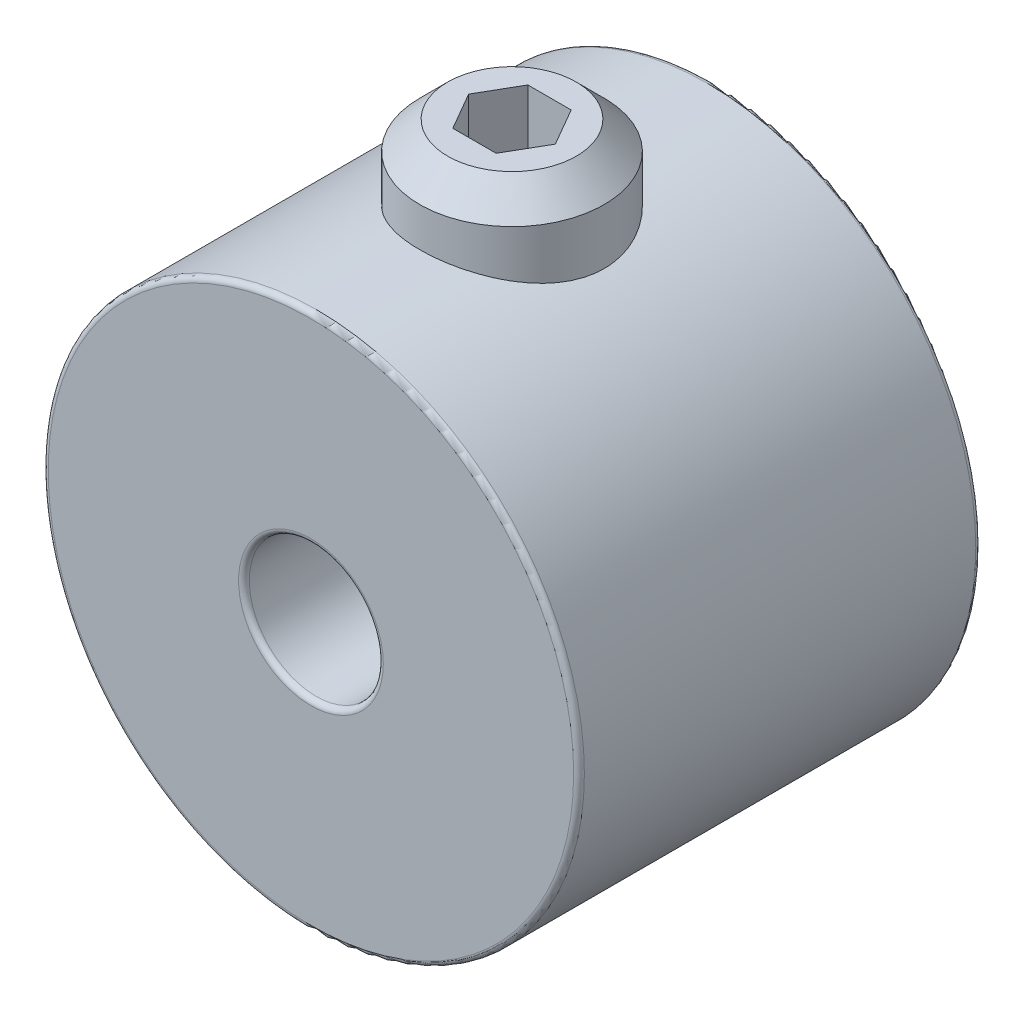
ISO-10303-21;
HEADER;
FILE_DESCRIPTION(('STEP AP214'),'2;1');
FILE_NAME('part.step','',(''),(''),'','','');
FILE_SCHEMA(('AUTOMOTIVE_DESIGN { 1 0 10303 214 1 1 1 1 }'));
ENDSEC;
DATA;
#1=APPLICATION_CONTEXT('core data for automotive mechanical design processes');
#2=APPLICATION_PROTOCOL_DEFINITION('international standard','automotive_design',2000,#1);
#3=PRODUCT_CONTEXT('',#1,'mechanical');
#4=PRODUCT('Part','Part','',(#3));
#5=PRODUCT_RELATED_PRODUCT_CATEGORY('part','',(#4));
#6=PRODUCT_DEFINITION_FORMATION('','',#4);
#7=PRODUCT_DEFINITION_CONTEXT('part definition',#1,'design');
#8=PRODUCT_DEFINITION('design','',#6,#7);
#9=PRODUCT_DEFINITION_SHAPE('','',#8);
#10=(LENGTH_UNIT() NAMED_UNIT(*) SI_UNIT(.MILLI.,.METRE.));
#11=(NAMED_UNIT(*) PLANE_ANGLE_UNIT() SI_UNIT($,.RADIAN.));
#12=(NAMED_UNIT(*) SI_UNIT($,.STERADIAN.) SOLID_ANGLE_UNIT());
#13=UNCERTAINTY_MEASURE_WITH_UNIT(LENGTH_MEASURE(1.E-05),#10,'distance_accuracy_value','');
#14=(GEOMETRIC_REPRESENTATION_CONTEXT(3) GLOBAL_UNCERTAINTY_ASSIGNED_CONTEXT((#13)) GLOBAL_UNIT_ASSIGNED_CONTEXT((#10,
#11,#12)) REPRESENTATION_CONTEXT('',''));
#15=CARTESIAN_POINT('',(0.,0.,0.));
#16=DIRECTION('',(0.,0.,1.));
#17=DIRECTION('',(1.,0.,0.));
#18=AXIS2_PLACEMENT_3D('',#15,#16,#17);
#19=CARTESIAN_POINT('',(0.,3.96875,0.));
#20=DIRECTION('',(0.,1.,0.));
#21=DIRECTION('',(-1.,0.,0.));
#22=AXIS2_PLACEMENT_3D('',#19,#20,#21);
#23=PLANE('',#22);
#24=CARTESIAN_POINT('',(0.,3.96875,0.));
#25=DIRECTION('',(0.,1.,0.));
#26=DIRECTION('',(-1.,0.,0.));
#27=AXIS2_PLACEMENT_3D('',#24,#25,#26);
#28=CIRCLE('',#27,0.761379651034047);
#29=CARTESIAN_POINT('',(-0.761379651034046,3.96875,0.));
#30=VERTEX_POINT('',#29);
#31=EDGE_CURVE('E12',#30,#30,#28,.T.);
#32=ORIENTED_EDGE('',*,*,#31,.T.);
#33=EDGE_LOOP('',(#32));
#34=FACE_BOUND('',#33,.T.);
#35=DIRECTION('',(1.,0.,0.));
#36=VECTOR('',#35,1.);
#37=CARTESIAN_POINT('',(-0.256632194654789,3.96874999999999,-0.444499999999997));
#38=LINE('',#37,#36);
#39=CARTESIAN_POINT('',(-0.256632194654789,3.96874999999999,-0.444499999999997));
#40=VERTEX_POINT('',#39);
#41=CARTESIAN_POINT('',(0.256632194654789,3.96875,-0.444499999999997));
#42=VERTEX_POINT('',#41);
#43=EDGE_CURVE('E112',#40,#42,#38,.T.);
#44=ORIENTED_EDGE('',*,*,#43,.T.);
#45=DIRECTION('',(0.5,0.,0.866025403784439));
#46=VECTOR('',#45,1.);
#47=CARTESIAN_POINT('',(0.256632194654789,3.96874999999999,-0.444499999999997));
#48=LINE('',#47,#46);
#49=CARTESIAN_POINT('',(0.513264389309578,3.96874999999999,0.));
#50=VERTEX_POINT('',#49);
#51=EDGE_CURVE('E58',#42,#50,#48,.T.);
#52=ORIENTED_EDGE('',*,*,#51,.T.);
#53=DIRECTION('',(-0.5,0.,0.866025403784439));
#54=VECTOR('',#53,1.);
#55=CARTESIAN_POINT('',(0.513264389309578,3.96874999999999,0.));
#56=LINE('',#55,#54);
#57=CARTESIAN_POINT('',(0.256632194654789,3.96874999999999,0.444500000000003));
#58=VERTEX_POINT('',#57);
#59=EDGE_CURVE('E116',#50,#58,#56,.T.);
#60=ORIENTED_EDGE('',*,*,#59,.T.);
#61=DIRECTION('',(-1.,0.,0.));
#62=VECTOR('',#61,1.);
#63=CARTESIAN_POINT('',(0.256632194654789,3.96874999999999,0.444500000000003));
#64=LINE('',#63,#62);
#65=CARTESIAN_POINT('',(-0.256632194654788,3.96874999999999,0.444500000000003));
#66=VERTEX_POINT('',#65);
#67=EDGE_CURVE('E179',#58,#66,#64,.T.);
#68=ORIENTED_EDGE('',*,*,#67,.T.);
#69=DIRECTION('',(-0.5,0.,-0.866025403784439));
#70=VECTOR('',#69,1.);
#71=CARTESIAN_POINT('',(-0.256632194654788,3.96874999999999,0.444500000000003));
#72=LINE('',#71,#70);
#73=CARTESIAN_POINT('',(-0.513264389309577,3.96874999999999,0.));
#74=VERTEX_POINT('',#73);
#75=EDGE_CURVE('E164',#66,#74,#72,.T.);
#76=ORIENTED_EDGE('',*,*,#75,.T.);
#77=DIRECTION('',(0.5,0.,-0.866025403784439));
#78=VECTOR('',#77,1.);
#79=CARTESIAN_POINT('',(-0.513264389309577,3.96874999999999,0.));
#80=LINE('',#79,#78);
#81=EDGE_CURVE('E160',#74,#40,#80,.T.);
#82=ORIENTED_EDGE('',*,*,#81,.T.);
#83=EDGE_LOOP('',(#44,#52,#60,#68,#76,#82));
#84=FACE_BOUND('',#83,.T.);
#85=ADVANCED_FACE('F44',(#34,#84),#23,.T.);
#86=CARTESIAN_POINT('',(0.,3.96875,0.));
#87=DIRECTION('',(0.,-1.,0.));
#88=DIRECTION('',(1.,0.,0.));
#89=AXIS2_PLACEMENT_3D('',#86,#87,#88);
#90=CONICAL_SURFACE('',#89,0.761379651034047,0.785398163397447);
#91=CARTESIAN_POINT('',(0.,3.63792965103404,0.));
#92=DIRECTION('',(0.,1.,0.));
#93=DIRECTION('',(-1.,0.,0.));
#94=AXIS2_PLACEMENT_3D('',#91,#92,#93);
#95=CIRCLE('',#94,1.0922);
#96=CARTESIAN_POINT('',(-1.0922,3.63792965103404,0.));
#97=VERTEX_POINT('',#96);
#98=EDGE_CURVE('E51',#97,#97,#95,.T.);
#99=ORIENTED_EDGE('',*,*,#98,.T.);
#100=EDGE_LOOP('',(#99));
#101=FACE_BOUND('',#100,.T.);
#102=ORIENTED_EDGE('',*,*,#31,.F.);
#103=EDGE_LOOP('',(#102));
#104=FACE_BOUND('',#103,.T.);
#105=ADVANCED_FACE('F134',(#101,#104),#90,.T.);
#106=CARTESIAN_POINT('',(0.,0.79375,0.));
#107=DIRECTION('',(0.,1.,0.));
#108=DIRECTION('',(-1.,0.,0.));
#109=AXIS2_PLACEMENT_3D('',#106,#107,#108);
#110=CYLINDRICAL_SURFACE('',#109,1.0922);
#111=CARTESIAN_POINT('',(0.,1.12457034896596,0.));
#112=DIRECTION('',(0.,1.,0.));
#113=DIRECTION('',(-1.,0.,0.));
#114=AXIS2_PLACEMENT_3D('',#111,#112,#113);
#115=CIRCLE('',#114,1.0922);
#116=CARTESIAN_POINT('',(-1.0922,1.12457034896596,0.));
#117=VERTEX_POINT('',#116);
#118=EDGE_CURVE('E129',#117,#117,#115,.T.);
#119=ORIENTED_EDGE('',*,*,#118,.T.);
#120=EDGE_LOOP('',(#119));
#121=FACE_BOUND('',#120,.T.);
#122=ORIENTED_EDGE('',*,*,#98,.F.);
#123=EDGE_LOOP('',(#122));
#124=FACE_BOUND('',#123,.T.);
#125=ADVANCED_FACE('F137',(#121,#124),#110,.T.);
#126=CARTESIAN_POINT('',(0.,1.12457034896596,0.));
#127=DIRECTION('',(0.,1.,0.));
#128=DIRECTION('',(-1.,0.,0.));
#129=AXIS2_PLACEMENT_3D('',#126,#127,#128);
#130=CONICAL_SURFACE('',#129,1.0922,0.785398163397448);
#131=CARTESIAN_POINT('',(0.,0.79375,0.));
#132=DIRECTION('',(0.,1.,0.));
#133=DIRECTION('',(-1.,0.,0.));
#134=AXIS2_PLACEMENT_3D('',#131,#132,#133);
#135=CIRCLE('',#134,0.761379651034046);
#136=CARTESIAN_POINT('',(-0.761379651034046,0.79375,0.));
#137=VERTEX_POINT('',#136);
#138=EDGE_CURVE('E121',#137,#137,#135,.T.);
#139=ORIENTED_EDGE('',*,*,#138,.T.);
#140=EDGE_LOOP('',(#139));
#141=FACE_BOUND('',#140,.T.);
#142=ORIENTED_EDGE('',*,*,#118,.F.);
#143=EDGE_LOOP('',(#142));
#144=FACE_BOUND('',#143,.T.);
#145=ADVANCED_FACE('F139',(#141,#144),#130,.T.);
#146=CARTESIAN_POINT('',(-0.761379651034046,0.79375,0.));
#147=DIRECTION('',(0.,-1.,0.));
#148=DIRECTION('',(1.,0.,0.));
#149=AXIS2_PLACEMENT_3D('',#146,#147,#148);
#150=PLANE('',#149);
#151=CARTESIAN_POINT('',(0.,0.79375,0.));
#152=DIRECTION('',(0.,1.,0.));
#153=DIRECTION('',(-1.,0.,0.));
#154=AXIS2_PLACEMENT_3D('',#151,#152,#153);
#155=CIRCLE('',#154,0.396984418759147);
#156=CARTESIAN_POINT('',(-0.396984418759147,0.79375,0.));
#157=VERTEX_POINT('',#156);
#158=EDGE_CURVE('E117',#157,#157,#155,.T.);
#159=ORIENTED_EDGE('',*,*,#158,.T.);
#160=EDGE_LOOP('',(#159));
#161=FACE_BOUND('',#160,.T.);
#162=ORIENTED_EDGE('',*,*,#138,.F.);
#163=EDGE_LOOP('',(#162));
#164=FACE_BOUND('',#163,.T.);
#165=ADVANCED_FACE('F146',(#161,#164),#150,.T.);
#166=CARTESIAN_POINT('',(0.,0.79375,0.));
#167=DIRECTION('',(0.,-1.,0.));
#168=DIRECTION('',(1.,0.,0.));
#169=AXIS2_PLACEMENT_3D('',#166,#167,#168);
#170=CONICAL_SURFACE('',#169,0.396984418759147,0.785398163397448);
#171=CARTESIAN_POINT('',(0.,1.19073441875915,0.));
#172=VERTEX_POINT('',#171);
#173=VERTEX_LOOP('',#172);
#174=FACE_BOUND('',#173,.T.);
#175=ORIENTED_EDGE('',*,*,#158,.F.);
#176=EDGE_LOOP('',(#175));
#177=FACE_BOUND('',#176,.T.);
#178=ADVANCED_FACE('F213',(#174,#177),#170,.F.);
#179=CARTESIAN_POINT('',(0.256632194654789,3.07974999999999,-0.444499999999997));
#180=DIRECTION('',(-0.866025403784439,0.,0.5));
#181=DIRECTION('',(0.5,0.,0.866025403784439));
#182=AXIS2_PLACEMENT_3D('',#179,#180,#181);
#183=PLANE('',#182);
#184=ORIENTED_EDGE('',*,*,#51,.F.);
#185=DIRECTION('',(0.,1.,0.));
#186=VECTOR('',#185,1.);
#187=CARTESIAN_POINT('',(0.256632194654789,3.07974999999999,-0.444499999999997));
#188=LINE('',#187,#186);
#189=CARTESIAN_POINT('',(0.256632194654789,3.07974999999999,-0.444499999999997));
#190=VERTEX_POINT('',#189);
#191=EDGE_CURVE('E111',#190,#42,#188,.T.);
#192=ORIENTED_EDGE('',*,*,#191,.F.);
#193=DIRECTION('',(0.5,0.,0.866025403784439));
#194=VECTOR('',#193,1.);
#195=CARTESIAN_POINT('',(0.256632194654789,3.07974999999999,-0.444499999999997));
#196=LINE('',#195,#194);
#197=CARTESIAN_POINT('',(0.513264389309578,3.07974999999999,0.));
#198=VERTEX_POINT('',#197);
#199=EDGE_CURVE('E102',#190,#198,#196,.T.);
#200=ORIENTED_EDGE('',*,*,#199,.T.);
#201=DIRECTION('',(0.,1.,0.));
#202=VECTOR('',#201,1.);
#203=CARTESIAN_POINT('',(0.513264389309578,3.07974999999999,0.));
#204=LINE('',#203,#202);
#205=EDGE_CURVE('E110',#198,#50,#204,.T.);
#206=ORIENTED_EDGE('',*,*,#205,.T.);
#207=EDGE_LOOP('',(#184,#192,#200,#206));
#208=FACE_BOUND('',#207,.T.);
#209=ADVANCED_FACE('F109',(#208),#183,.T.);
#210=CARTESIAN_POINT('',(0.513264389309578,3.07974999999999,0.));
#211=DIRECTION('',(-0.866025403784439,0.,-0.5));
#212=DIRECTION('',(-0.5,0.,0.866025403784439));
#213=AXIS2_PLACEMENT_3D('',#210,#211,#212);
#214=PLANE('',#213);
#215=ORIENTED_EDGE('',*,*,#59,.F.);
#216=ORIENTED_EDGE('',*,*,#205,.F.);
#217=DIRECTION('',(-0.5,0.,0.866025403784439));
#218=VECTOR('',#217,1.);
#219=CARTESIAN_POINT('',(0.513264389309578,3.07974999999999,0.));
#220=LINE('',#219,#218);
#221=CARTESIAN_POINT('',(0.256632194654789,3.07974999999999,0.444500000000003));
#222=VERTEX_POINT('',#221);
#223=EDGE_CURVE('E98',#198,#222,#220,.T.);
#224=ORIENTED_EDGE('',*,*,#223,.T.);
#225=DIRECTION('',(0.,1.,0.));
#226=VECTOR('',#225,1.);
#227=CARTESIAN_POINT('',(0.256632194654789,3.07974999999999,0.444500000000003));
#228=LINE('',#227,#226);
#229=EDGE_CURVE('E118',#222,#58,#228,.T.);
#230=ORIENTED_EDGE('',*,*,#229,.T.);
#231=EDGE_LOOP('',(#215,#216,#224,#230));
#232=FACE_BOUND('',#231,.T.);
#233=ADVANCED_FACE('F114',(#232),#214,.T.);
#234=CARTESIAN_POINT('',(0.256632194654789,3.07974999999999,0.444500000000003));
#235=DIRECTION('',(0.,0.,-1.));
#236=DIRECTION('',(-1.,0.,0.));
#237=AXIS2_PLACEMENT_3D('',#234,#235,#236);
#238=PLANE('',#237);
#239=ORIENTED_EDGE('',*,*,#67,.F.);
#240=ORIENTED_EDGE('',*,*,#229,.F.);
#241=DIRECTION('',(-1.,0.,0.));
#242=VECTOR('',#241,1.);
#243=CARTESIAN_POINT('',(0.256632194654789,3.07974999999999,0.444500000000003));
#244=LINE('',#243,#242);
#245=CARTESIAN_POINT('',(-0.256632194654788,3.07974999999999,0.444500000000003));
#246=VERTEX_POINT('',#245);
#247=EDGE_CURVE('E104',#222,#246,#244,.T.);
#248=ORIENTED_EDGE('',*,*,#247,.T.);
#249=DIRECTION('',(0.,1.,0.));
#250=VECTOR('',#249,1.);
#251=CARTESIAN_POINT('',(-0.256632194654788,3.07974999999999,0.444500000000003));
#252=LINE('',#251,#250);
#253=EDGE_CURVE('E123',#246,#66,#252,.T.);
#254=ORIENTED_EDGE('',*,*,#253,.T.);
#255=EDGE_LOOP('',(#239,#240,#248,#254));
#256=FACE_BOUND('',#255,.T.);
#257=ADVANCED_FACE('F177',(#256),#238,.T.);
#258=CARTESIAN_POINT('',(-0.256632194654788,3.07974999999999,0.444500000000003));
#259=DIRECTION('',(0.866025403784438,0.,-0.5));
#260=DIRECTION('',(-0.5,0.,-0.866025403784438));
#261=AXIS2_PLACEMENT_3D('',#258,#259,#260);
#262=PLANE('',#261);
#263=ORIENTED_EDGE('',*,*,#75,.F.);
#264=ORIENTED_EDGE('',*,*,#253,.F.);
#265=DIRECTION('',(-0.5,0.,-0.866025403784439));
#266=VECTOR('',#265,1.);
#267=CARTESIAN_POINT('',(-0.256632194654788,3.07974999999999,0.444500000000003));
#268=LINE('',#267,#266);
#269=CARTESIAN_POINT('',(-0.513264389309577,3.07974999999999,0.));
#270=VERTEX_POINT('',#269);
#271=EDGE_CURVE('E190',#246,#270,#268,.T.);
#272=ORIENTED_EDGE('',*,*,#271,.T.);
#273=DIRECTION('',(0.,1.,0.));
#274=VECTOR('',#273,1.);
#275=CARTESIAN_POINT('',(-0.513264389309577,3.07974999999999,0.));
#276=LINE('',#275,#274);
#277=EDGE_CURVE('E172',#270,#74,#276,.T.);
#278=ORIENTED_EDGE('',*,*,#277,.T.);
#279=EDGE_LOOP('',(#263,#264,#272,#278));
#280=FACE_BOUND('',#279,.T.);
#281=ADVANCED_FACE('F181',(#280),#262,.T.);
#282=CARTESIAN_POINT('',(-0.513264389309577,3.07974999999999,0.));
#283=DIRECTION('',(0.866025403784439,0.,0.5));
#284=DIRECTION('',(0.5,0.,-0.866025403784439));
#285=AXIS2_PLACEMENT_3D('',#282,#283,#284);
#286=PLANE('',#285);
#287=ORIENTED_EDGE('',*,*,#81,.F.);
#288=ORIENTED_EDGE('',*,*,#277,.F.);
#289=DIRECTION('',(0.5,0.,-0.866025403784439));
#290=VECTOR('',#289,1.);
#291=CARTESIAN_POINT('',(-0.513264389309577,3.07974999999999,0.));
#292=LINE('',#291,#290);
#293=CARTESIAN_POINT('',(-0.256632194654789,3.07974999999999,-0.444499999999997));
#294=VERTEX_POINT('',#293);
#295=EDGE_CURVE('E188',#270,#294,#292,.T.);
#296=ORIENTED_EDGE('',*,*,#295,.T.);
#297=DIRECTION('',(0.,1.,0.));
#298=VECTOR('',#297,1.);
#299=CARTESIAN_POINT('',(-0.256632194654789,3.07974999999999,-0.444499999999997));
#300=LINE('',#299,#298);
#301=EDGE_CURVE('E169',#294,#40,#300,.T.);
#302=ORIENTED_EDGE('',*,*,#301,.T.);
#303=EDGE_LOOP('',(#287,#288,#296,#302));
#304=FACE_BOUND('',#303,.T.);
#305=ADVANCED_FACE('F194',(#304),#286,.T.);
#306=CARTESIAN_POINT('',(-0.256632194654789,3.07974999999999,-0.444499999999997));
#307=DIRECTION('',(0.,0.,1.));
#308=DIRECTION('',(1.,0.,0.));
#309=AXIS2_PLACEMENT_3D('',#306,#307,#308);
#310=PLANE('',#309);
#311=ORIENTED_EDGE('',*,*,#43,.F.);
#312=ORIENTED_EDGE('',*,*,#301,.F.);
#313=DIRECTION('',(1.,0.,0.));
#314=VECTOR('',#313,1.);
#315=CARTESIAN_POINT('',(-0.256632194654789,3.07974999999999,-0.444499999999997));
#316=LINE('',#315,#314);
#317=EDGE_CURVE('E170',#294,#190,#316,.T.);
#318=ORIENTED_EDGE('',*,*,#317,.T.);
#319=ORIENTED_EDGE('',*,*,#191,.T.);
#320=EDGE_LOOP('',(#311,#312,#318,#319));
#321=FACE_BOUND('',#320,.T.);
#322=ADVANCED_FACE('F195',(#321),#310,.T.);
#323=CARTESIAN_POINT('',(0.769896583964366,3.07974999999999,0.444500000000003));
#324=DIRECTION('',(0.,-1.,0.));
#325=DIRECTION('',(0.,0.,-1.));
#326=AXIS2_PLACEMENT_3D('',#323,#324,#325);
#327=PLANE('',#326);
#328=ORIENTED_EDGE('',*,*,#199,.F.);
#329=ORIENTED_EDGE('',*,*,#317,.F.);
#330=ORIENTED_EDGE('',*,*,#295,.F.);
#331=ORIENTED_EDGE('',*,*,#271,.F.);
#332=ORIENTED_EDGE('',*,*,#247,.F.);
#333=ORIENTED_EDGE('',*,*,#223,.F.);
#334=EDGE_LOOP('',(#328,#329,#330,#331,#332,#333));
#335=FACE_BOUND('',#334,.T.);
#336=ADVANCED_FACE('F100',(#335),#327,.F.);
#337=CLOSED_SHELL('',(#85,#105,#125,#145,#165,#178,#209,#233,#257,#281,#305,#322,#336));
#338=MANIFOLD_SOLID_BREP('B2',#337);
#339=CARTESIAN_POINT('',(0.,0.,2.38125));
#340=DIRECTION('',(0.,0.,1.));
#341=DIRECTION('',(1.,0.,0.));
#342=AXIS2_PLACEMENT_3D('',#339,#340,#341);
#343=PLANE('',#342);
#344=CARTESIAN_POINT('',(0.,0.,2.38125));
#345=DIRECTION('',(0.,0.,1.));
#346=DIRECTION('',(1.,0.,0.));
#347=AXIS2_PLACEMENT_3D('',#344,#345,#346);
#348=CIRCLE('',#347,0.85725);
#349=CARTESIAN_POINT('',(0.85725,0.,2.38125));
#350=VERTEX_POINT('',#349);
#351=EDGE_CURVE('E400',#350,#350,#348,.F.);
#352=ORIENTED_EDGE('',*,*,#351,.T.);
#353=EDGE_LOOP('',(#352));
#354=FACE_BOUND('',#353,.T.);
#355=CARTESIAN_POINT('',(0.,0.,2.38125));
#356=DIRECTION('',(0.,0.,1.));
#357=DIRECTION('',(1.,0.,0.));
#358=AXIS2_PLACEMENT_3D('',#355,#356,#357);
#359=CIRCLE('',#358,3.1115);
#360=CARTESIAN_POINT('',(3.1115,0.,2.38125));
#361=VERTEX_POINT('',#360);
#362=EDGE_CURVE('E403',#361,#361,#359,.T.);
#363=ORIENTED_EDGE('',*,*,#362,.T.);
#364=EDGE_LOOP('',(#363));
#365=FACE_BOUND('',#364,.T.);
#366=ADVANCED_FACE('F298',(#354,#365),#343,.T.);
#367=CARTESIAN_POINT('',(0.,0.,-2.38125));
#368=DIRECTION('',(0.,0.,1.));
#369=DIRECTION('',(1.,0.,0.));
#370=AXIS2_PLACEMENT_3D('',#367,#368,#369);
#371=PLANE('',#370);
#372=CARTESIAN_POINT('',(0.,0.,-2.38125));
#373=DIRECTION('',(0.,0.,1.));
#374=DIRECTION('',(1.,0.,0.));
#375=AXIS2_PLACEMENT_3D('',#372,#373,#374);
#376=CIRCLE('',#375,0.85725);
#377=CARTESIAN_POINT('',(0.85725,0.,-2.38125));
#378=VERTEX_POINT('',#377);
#379=EDGE_CURVE('E419',#378,#378,#376,.T.);
#380=ORIENTED_EDGE('',*,*,#379,.T.);
#381=EDGE_LOOP('',(#380));
#382=FACE_BOUND('',#381,.T.);
#383=CARTESIAN_POINT('',(0.,0.,-2.38125));
#384=DIRECTION('',(0.,0.,1.));
#385=DIRECTION('',(1.,0.,0.));
#386=AXIS2_PLACEMENT_3D('',#383,#384,#385);
#387=CIRCLE('',#386,3.1115);
#388=CARTESIAN_POINT('',(3.1115,0.,-2.38125));
#389=VERTEX_POINT('',#388);
#390=EDGE_CURVE('E422',#389,#389,#387,.F.);
#391=ORIENTED_EDGE('',*,*,#390,.T.);
#392=EDGE_LOOP('',(#391));
#393=FACE_BOUND('',#392,.T.);
#394=ADVANCED_FACE('F373',(#382,#393),#371,.F.);
#395=CARTESIAN_POINT('',(0.,0.,2.38125));
#396=DIRECTION('',(0.,0.,-1.));
#397=DIRECTION('',(-1.,0.,0.));
#398=AXIS2_PLACEMENT_3D('',#395,#396,#397);
#399=CYLINDRICAL_SURFACE('',#398,3.175);
#400=CARTESIAN_POINT('',(0.,0.,-2.31775));
#401=DIRECTION('',(0.,0.,1.));
#402=DIRECTION('',(1.,0.,0.));
#403=AXIS2_PLACEMENT_3D('',#400,#401,#402);
#404=CIRCLE('',#403,3.175);
#405=CARTESIAN_POINT('',(3.175,0.,-2.31775));
#406=VERTEX_POINT('',#405);
#407=EDGE_CURVE('E42',#406,#406,#404,.T.);
#408=ORIENTED_EDGE('',*,*,#407,.T.);
#409=EDGE_LOOP('',(#408));
#410=FACE_BOUND('',#409,.T.);
#411=CARTESIAN_POINT('',(0.,0.,2.31775));
#412=DIRECTION('',(0.,0.,1.));
#413=DIRECTION('',(1.,0.,0.));
#414=AXIS2_PLACEMENT_3D('',#411,#412,#413);
#415=CIRCLE('',#414,3.175);
#416=CARTESIAN_POINT('',(3.175,0.,2.31775));
#417=VERTEX_POINT('',#416);
#418=EDGE_CURVE('E306',#417,#417,#415,.F.);
#419=ORIENTED_EDGE('',*,*,#418,.T.);
#420=EDGE_LOOP('',(#419));
#421=FACE_BOUND('',#420,.T.);
#422=CARTESIAN_POINT('',(0.,3.175,-1.0922));
#423=CARTESIAN_POINT('',(0.0594846020309207,3.17500046240211,-1.09220067776336));
#424=CARTESIAN_POINT('',(0.118964417392983,3.17331309770515,-1.08732474943332));
#425=CARTESIAN_POINT('',(0.236165575560328,3.16674862821655,-1.06801421420172));
#426=CARTESIAN_POINT('',(0.293886847425228,3.16187139492214,-1.05357922221619));
#427=CARTESIAN_POINT('',(0.405864386131336,3.14945558189118,-1.01570847559844));
#428=CARTESIAN_POINT('',(0.460126479608609,3.14192162492595,-0.992288349157221));
#429=CARTESIAN_POINT('',(0.563951670780157,3.12495670035449,-0.93718497347966));
#430=CARTESIAN_POINT('',(0.613513746977305,3.11552532174851,-0.90549993354189));
#431=CARTESIAN_POINT('',(0.708345981997349,3.09536748599177,-0.833549793023832));
#432=CARTESIAN_POINT('',(0.753420581080437,3.08460856616823,-0.793036095464729));
#433=CARTESIAN_POINT('',(0.836287201313274,3.06318202626277,-0.705106930810133));
#434=CARTESIAN_POINT('',(0.874077475869601,3.05251442866203,-0.657689813224409));
#435=CARTESIAN_POINT('',(0.942449667144391,3.03211625317869,-0.555502633773027));
#436=CARTESIAN_POINT('',(0.972772004242332,3.02242494168238,-0.500550289037269));
#437=CARTESIAN_POINT('',(1.02365986840636,3.00557304934573,-0.385938932554227));
#438=CARTESIAN_POINT('',(1.04422859522432,2.99841163874752,-0.326281471860006));
#439=CARTESIAN_POINT('',(1.07428217623222,2.98777347822483,-0.206184989401394));
#440=CARTESIAN_POINT('',(1.08413528317815,2.98417471796849,-0.145849260130647));
#441=CARTESIAN_POINT('',(1.0936293422162,2.98070929052043,-0.0242818603581955));
#442=CARTESIAN_POINT('',(1.09327369703875,2.9808413797803,0.0369495048132304));
#443=CARTESIAN_POINT('',(1.08264518051001,2.98471622367503,0.15537594698848));
#444=CARTESIAN_POINT('',(1.07285993787238,2.98828143608762,0.21262162120599));
#445=CARTESIAN_POINT('',(1.04444809257435,2.99832918363266,0.324602786748427));
#446=CARTESIAN_POINT('',(1.02582036647004,3.00481208945471,0.379337958142868));
#447=CARTESIAN_POINT('',(0.979946155457723,3.02008630868423,0.485823874073929));
#448=CARTESIAN_POINT('',(0.952559709269745,3.02891468439999,0.537508775952465));
#449=CARTESIAN_POINT('',(0.890042665092254,3.04787036106727,0.635700434418318));
#450=CARTESIAN_POINT('',(0.854909715839764,3.05799805600451,0.682205612361646));
#451=CARTESIAN_POINT('',(0.775582303075404,3.07910226603654,0.771448246930752));
#452=CARTESIAN_POINT('',(0.73099140787507,3.09009460085175,0.813830332142646));
#453=CARTESIAN_POINT('',(0.635201425279242,3.11119696962203,0.890611072740099));
#454=CARTESIAN_POINT('',(0.584001619859181,3.12130690750882,0.925008859534208));
#455=CARTESIAN_POINT('',(0.475656258506914,3.13965351857311,0.985155785888083));
#456=CARTESIAN_POINT('',(0.418450696974598,3.14786801484684,1.01080406807194));
#457=CARTESIAN_POINT('',(0.300185917404429,3.16133648512637,1.05200100732076));
#458=CARTESIAN_POINT('',(0.239128138213303,3.16659155731554,1.06755341109282));
#459=CARTESIAN_POINT('',(0.117896317738876,3.17336439892456,1.08747445903585));
#460=CARTESIAN_POINT('',(0.0578099639913719,3.17504237265569,1.09232287317751));
#461=CARTESIAN_POINT('',(-0.0623332738147485,3.17495601635524,1.09207244365528));
#462=CARTESIAN_POINT('',(-0.122390161241558,3.17319231051902,1.0869754037347));
#463=CARTESIAN_POINT('',(-0.238812029062745,3.16652661983918,1.06735505169543));
#464=CARTESIAN_POINT('',(-0.295233733639432,3.16172435356365,1.05313106311735));
#465=CARTESIAN_POINT('',(-0.40486329275546,3.14956427513173,1.01603966787358));
#466=CARTESIAN_POINT('',(-0.458070732147159,3.14220613368884,0.99317114745505));
#467=CARTESIAN_POINT('',(-0.561376644474131,3.12542732240057,0.938753513119189));
#468=CARTESIAN_POINT('',(-0.611351185309363,3.11595599473834,0.906985202115636));
#469=CARTESIAN_POINT('',(-0.705413260389634,3.09601884400336,0.835924650964162));
#470=CARTESIAN_POINT('',(-0.749498887863778,3.08555270068772,0.796629983833069));
#471=CARTESIAN_POINT('',(-0.832761932494861,3.06415908468272,0.70937869072914));
#472=CARTESIAN_POINT('',(-0.871597180658826,3.05323388187208,0.661094168762527));
#473=CARTESIAN_POINT('',(-0.940662415087565,3.03266910436469,0.558462520202315));
#474=CARTESIAN_POINT('',(-0.970892189405496,3.02302956133596,0.504115244333177));
#475=CARTESIAN_POINT('',(-1.02178181907345,3.00621170847614,0.390789030507985));
#476=CARTESIAN_POINT('',(-1.04244911910713,2.99903148512324,0.331813737589468));
#477=CARTESIAN_POINT('',(-1.07345528990888,2.98807537266748,0.21091261697484));
#478=CARTESIAN_POINT('',(-1.08379922024543,2.98429781597822,0.148988250251477));
#479=CARTESIAN_POINT('',(-1.09345506243118,2.98077251153208,0.0275865571051166));
#480=CARTESIAN_POINT('',(-1.09333861639927,2.98081594992044,-0.0318397142550356));
#481=CARTESIAN_POINT('',(-1.08349816619879,2.98440673008171,-0.149777966616516));
#482=CARTESIAN_POINT('',(-1.07377480738863,2.98795383649058,-0.208290008764325));
#483=CARTESIAN_POINT('',(-1.0454119787783,2.99799200807781,-0.321476208394212));
#484=CARTESIAN_POINT('',(-1.02696929770449,3.00441794020765,-0.376205917605462));
#485=CARTESIAN_POINT('',(-0.981853801361199,3.01946201853326,-0.481834359726789));
#486=CARTESIAN_POINT('',(-0.955179087615241,3.02808067033479,-0.532732205558465));
#487=CARTESIAN_POINT('',(-0.892928829249315,3.04703241339124,-0.631788033854481));
#488=CARTESIAN_POINT('',(-0.85700071747526,3.05742607068258,-0.67971277445767));
#489=CARTESIAN_POINT('',(-0.777846885867387,3.07851503990585,-0.769037264309249));
#490=CARTESIAN_POINT('',(-0.734619040076192,3.08921043895834,-0.810435105867663));
#491=CARTESIAN_POINT('',(-0.639887868316707,3.11024393102862,-0.887310582942295));
#492=CARTESIAN_POINT('',(-0.588110802917563,3.12054748918466,-0.922461605379172));
#493=CARTESIAN_POINT('',(-0.479036702663417,3.13914069823244,-0.983528835857861));
#494=CARTESIAN_POINT('',(-0.421740654067793,3.1474307080225,-1.00944669002029));
#495=CARTESIAN_POINT('',(-0.30460399848366,3.16089121489231,-1.05065742904496));
#496=CARTESIAN_POINT('',(-0.24485343190304,3.16612971072103,-1.06618316659523));
#497=CARTESIAN_POINT('',(-0.123399769020607,3.17318331070581,-1.08695244032922));
#498=CARTESIAN_POINT('',(-0.0616973098097679,3.17499952039746,-1.0921992970252));
#499=CARTESIAN_POINT('',(0.,3.175,-1.0922));
#500=B_SPLINE_CURVE_WITH_KNOTS('',3,(#422,#423,#424,#425,#426,#427,#428,#429,#430,#431,#432,
#433,#434,#435,#436,#437,#438,#439,#440,#441,#442,#443,#444,#445,#446,#447,#448,#449,#450,#451,
#452,#453,#454,#455,#456,#457,#458,#459,#460,#461,#462,#463,#464,#465,#466,#467,#468,#469,#470,
#471,#472,#473,#474,#475,#476,#477,#478,#479,#480,#481,#482,#483,#484,#485,#486,#487,#488,#489,
#490,#491,#492,#493,#494,#495,#496,#497,#498,#499),.UNSPECIFIED.,.T.,.F.,(4,2,2,2,2,2,2,2,2,2,2,
2,2,2,2,2,2,2,2,2,2,2,2,2,2,2,2,2,2,2,2,2,2,2,2,2,2,2,4),(0.,0.178226627504907,
0.356460435252166,0.534385629329087,0.712349405289069,0.896184888463809,1.08006439597108,
1.26964039599689,1.45915416096112,1.6419264589359,1.82463783686604,1.99838110590845,
2.17214645506889,2.3488402727861,2.52558779563231,2.71220438339439,2.89884126319393,
3.08756208837795,3.27621283679708,3.45621995689709,3.63619443329323,3.81054886361574,
3.98492576524941,4.1640458121491,4.34322371645711,4.53109994829692,4.71898080699753,
4.90671514746013,5.09435743252528,5.27175196986007,5.44913459126775,5.62269212835781,
5.79628972134348,5.97786129853819,6.1594858477024,6.34883385519357,6.53814808816458,
6.72306413396123,6.90792043421528),.UNSPECIFIED.);
#501=CARTESIAN_POINT('',(0.,3.175,-1.0922));
#502=VERTEX_POINT('',#501);
#503=EDGE_CURVE('E332',#502,#502,#500,.T.);
#504=ORIENTED_EDGE('',*,*,#503,.T.);
#505=EDGE_LOOP('',(#504));
#506=FACE_BOUND('',#505,.T.);
#507=ADVANCED_FACE('F368',(#410,#421,#506),#399,.T.);
#508=CARTESIAN_POINT('',(0.,0.,2.38125));
#509=DIRECTION('',(0.,0.,-1.));
#510=DIRECTION('',(-1.,0.,0.));
#511=AXIS2_PLACEMENT_3D('',#508,#509,#510);
#512=CYLINDRICAL_SURFACE('',#511,0.79375);
#513=CARTESIAN_POINT('',(0.,0.,-2.31775));
#514=DIRECTION('',(0.,0.,1.));
#515=DIRECTION('',(1.,0.,0.));
#516=AXIS2_PLACEMENT_3D('',#513,#514,#515);
#517=CIRCLE('',#516,0.79375);
#518=CARTESIAN_POINT('',(0.79375,0.,-2.31775));
#519=VERTEX_POINT('',#518);
#520=EDGE_CURVE('E405',#519,#519,#517,.F.);
#521=ORIENTED_EDGE('',*,*,#520,.T.);
#522=EDGE_LOOP('',(#521));
#523=FACE_BOUND('',#522,.T.);
#524=CARTESIAN_POINT('',(0.,0.,2.31775));
#525=DIRECTION('',(0.,0.,1.));
#526=DIRECTION('',(1.,0.,0.));
#527=AXIS2_PLACEMENT_3D('',#524,#525,#526);
#528=CIRCLE('',#527,0.79375);
#529=CARTESIAN_POINT('',(0.79375,0.,2.31775));
#530=VERTEX_POINT('',#529);
#531=EDGE_CURVE('E409',#530,#530,#528,.T.);
#532=ORIENTED_EDGE('',*,*,#531,.T.);
#533=EDGE_LOOP('',(#532));
#534=FACE_BOUND('',#533,.T.);
#535=DIRECTION('',(0.,0.,-1.));
#536=VECTOR('',#535,1.);
#537=CARTESIAN_POINT('',(-0.79375,0.,2.38125));
#538=LINE('',#537,#536);
#539=CARTESIAN_POINT('',(-0.79375,0.,0.750241146232333));
#540=VERTEX_POINT('',#539);
#541=CARTESIAN_POINT('',(-0.79375,0.,-0.750241146232328));
#542=VERTEX_POINT('',#541);
#543=EDGE_CURVE('E319',#540,#542,#538,.T.);
#544=ORIENTED_EDGE('',*,*,#543,.F.);
#545=CARTESIAN_POINT('',(0.79375,0.,0.750241146232333));
#546=CARTESIAN_POINT('',(0.793753869040059,0.0189485090896623,0.750230348704358));
#547=CARTESIAN_POINT('',(0.793071145503696,0.0378811415661062,0.750959714772954));
#548=CARTESIAN_POINT('',(0.790373835471899,0.0755130733606904,0.753801177745584));
#549=CARTESIAN_POINT('',(0.788361684120575,0.0942127357275636,0.755910746431358));
#550=CARTESIAN_POINT('',(0.780456517357678,0.14929462674049,0.764098221649477));
#551=CARTESIAN_POINT('',(0.772692443943445,0.185148551588154,0.772039907030764));
#552=CARTESIAN_POINT('',(0.752789067583548,0.254240089603804,0.791452842560357));
#553=CARTESIAN_POINT('',(0.740679351989591,0.28749358670091,0.802900149177063));
#554=CARTESIAN_POINT('',(0.712527951088616,0.351525032328514,0.8279866967805));
#555=CARTESIAN_POINT('',(0.696472739402813,0.382293970428342,0.841633421455605));
#556=CARTESIAN_POINT('',(0.657352968799689,0.446775279762382,0.872652979501446));
#557=CARTESIAN_POINT('',(0.633535345588702,0.479927474156518,0.890239671875602));
#558=CARTESIAN_POINT('',(0.58108938400962,0.542248154600114,0.925329145004276));
#559=CARTESIAN_POINT('',(0.552458377814958,0.5714144150963,0.942831873657913));
#560=CARTESIAN_POINT('',(0.484791325848602,0.630387466809915,0.979603893055351));
#561=CARTESIAN_POINT('',(0.4448105347216,0.659301395440574,0.998594861562305));
#562=CARTESIAN_POINT('',(0.358909996400216,0.70970905502616,1.03257148294886));
#563=CARTESIAN_POINT('',(0.313002586019066,0.731217868617955,1.04756526301219));
#564=CARTESIAN_POINT('',(0.230395311552464,0.760454766895544,1.06821378550351));
#565=CARTESIAN_POINT('',(0.194822799920851,0.770365293524651,1.07531331307823));
#566=CARTESIAN_POINT('',(0.12213936929429,0.785170382449809,1.08596833225314));
#567=CARTESIAN_POINT('',(0.0850297928822721,0.790069230027284,1.08952685155314));
#568=CARTESIAN_POINT('',(0.0102330055328561,0.794569926707044,1.09279493203442));
#569=CARTESIAN_POINT('',(-0.0274553317498879,0.794159643879406,1.09249567779709));
#570=CARTESIAN_POINT('',(-0.102171028487219,0.788039223855471,1.08805479563182));
#571=CARTESIAN_POINT('',(-0.139198214432969,0.782327715680076,1.0839121737495));
#572=CARTESIAN_POINT('',(-0.210494732252973,0.766178707442252,1.07231583062418));
#573=CARTESIAN_POINT('',(-0.244812786899738,0.755882121319326,1.06496095286409));
#574=CARTESIAN_POINT('',(-0.311137494853796,0.731086450910595,1.04750742437399));
#575=CARTESIAN_POINT('',(-0.343143669948319,0.716586500249918,1.03740820802259));
#576=CARTESIAN_POINT('',(-0.407788421707288,0.682081485157338,1.01386392322143));
#577=CARTESIAN_POINT('',(-0.44010526572803,0.661644864901013,1.00017231229953));
#578=CARTESIAN_POINT('',(-0.501020039545261,0.616807095001622,0.971092896646389));
#579=CARTESIAN_POINT('',(-0.529614480088816,0.59240227320418,0.955703525097858));
#580=CARTESIAN_POINT('',(-0.587928250312253,0.535119300251137,0.921191572974329));
#581=CARTESIAN_POINT('',(-0.616839550651284,0.501511393417624,0.901912969982579));
#582=CARTESIAN_POINT('',(-0.668868661378193,0.429676366493409,0.864030899898016));
#583=CARTESIAN_POINT('',(-0.691983547185794,0.391446928968731,0.845427777650772));
#584=CARTESIAN_POINT('',(-0.727528724591399,0.319353391141331,0.814879345248693));
#585=CARTESIAN_POINT('',(-0.741188971105563,0.286339502447117,0.802364980732053));
#586=CARTESIAN_POINT('',(-0.764101531811246,0.217899345088783,0.780576539323859));
#587=CARTESIAN_POINT('',(-0.773373030435587,0.182484364088208,0.771288408028822));
#588=CARTESIAN_POINT('',(-0.784624090326342,0.122419247309872,0.75980829739695));
#589=CARTESIAN_POINT('',(-0.788016990593888,0.0982885530782255,0.75627277739082));
#590=CARTESIAN_POINT('',(-0.792593217455258,0.0494534779937678,0.751465475958546));
#591=CARTESIAN_POINT('',(-0.79376317298976,0.0247465248031979,0.750207395503738));
#592=CARTESIAN_POINT('',(-0.79375,0.,0.750241146232333));
#593=B_SPLINE_CURVE_WITH_KNOTS('',3,(#545,#546,#547,#548,#549,#550,#551,#552,#553,#554,#555,
#556,#557,#558,#559,#560,#561,#562,#563,#564,#565,#566,#567,#568,#569,#570,#571,#572,#573,#574,
#575,#576,#577,#578,#579,#580,#581,#582,#583,#584,#585,#586,#587,#588,#589,#590,#591,#592),
.UNSPECIFIED.,.F.,.F.,(4,2,2,2,2,2,2,2,2,2,2,2,2,2,2,2,2,2,2,2,2,2,2,4),(0.,0.0567909388545267,
0.113478139747836,0.225412532886212,0.336598845236076,0.448171790561834,0.581053787231751,
0.714009678285773,0.871733950856724,1.02913504544065,1.14146715138787,1.25370312627028,
1.36619561754359,1.47871720922834,1.58799666500339,1.69729866090605,1.81869225785358,
1.940198837959,2.08466026415903,2.22919443236173,2.34239658154909,2.45509921572916,
2.52877118980801,2.60288491656086),.UNSPECIFIED.);
#594=CARTESIAN_POINT('',(0.79375,0.,0.750241146232333));
#595=VERTEX_POINT('',#594);
#596=EDGE_CURVE('E331',#595,#540,#593,.T.);
#597=ORIENTED_EDGE('',*,*,#596,.F.);
#598=DIRECTION('',(0.,0.,-1.));
#599=VECTOR('',#598,1.);
#600=CARTESIAN_POINT('',(0.79375,0.,2.38125));
#601=LINE('',#600,#599);
#602=CARTESIAN_POINT('',(0.79375,0.,-0.750241146232328));
#603=VERTEX_POINT('',#602);
#604=EDGE_CURVE('E326',#603,#595,#601,.F.);
#605=ORIENTED_EDGE('',*,*,#604,.F.);
#606=CARTESIAN_POINT('',(-0.79375,0.,-0.750241146232327));
#607=CARTESIAN_POINT('',(-0.793753869040059,0.0189485090896623,-0.750230348704353));
#608=CARTESIAN_POINT('',(-0.793071145503696,0.0378811415661061,-0.750959714772949));
#609=CARTESIAN_POINT('',(-0.790373835471899,0.0755130733606903,-0.753801177745579));
#610=CARTESIAN_POINT('',(-0.788361684120575,0.0942127357275634,-0.755910746431353));
#611=CARTESIAN_POINT('',(-0.780456517357678,0.149294626740489,-0.764098221649472));
#612=CARTESIAN_POINT('',(-0.772692443943445,0.185148551588154,-0.772039907030759));
#613=CARTESIAN_POINT('',(-0.752789067583548,0.254240089603804,-0.791452842560352));
#614=CARTESIAN_POINT('',(-0.740679351989591,0.287493586700909,-0.802900149177058));
#615=CARTESIAN_POINT('',(-0.712527951088616,0.351525032328514,-0.827986696780494));
#616=CARTESIAN_POINT('',(-0.696472739402813,0.382293970428342,-0.841633421455599));
#617=CARTESIAN_POINT('',(-0.65735296879969,0.446775279762382,-0.87265297950144));
#618=CARTESIAN_POINT('',(-0.633535345588702,0.479927474156517,-0.890239671875596));
#619=CARTESIAN_POINT('',(-0.58108938400962,0.542248154600113,-0.92532914500427));
#620=CARTESIAN_POINT('',(-0.552458377814958,0.5714144150963,-0.942831873657908));
#621=CARTESIAN_POINT('',(-0.484791325848603,0.630387466809914,-0.979603893055345));
#622=CARTESIAN_POINT('',(-0.444810534721601,0.659301395440573,-0.9985948615623));
#623=CARTESIAN_POINT('',(-0.358909996400217,0.70970905502616,-1.03257148294885));
#624=CARTESIAN_POINT('',(-0.313002586019067,0.731217868617954,-1.04756526301219));
#625=CARTESIAN_POINT('',(-0.230395311552465,0.760454766895544,-1.0682137855035));
#626=CARTESIAN_POINT('',(-0.194822799920851,0.770365293524651,-1.07531331307823));
#627=CARTESIAN_POINT('',(-0.12213936929429,0.785170382449809,-1.08596833225313));
#628=CARTESIAN_POINT('',(-0.0850297928822725,0.790069230027284,-1.08952685155313));
#629=CARTESIAN_POINT('',(-0.0102330055328565,0.794569926707044,-1.09279493203441));
#630=CARTESIAN_POINT('',(0.0274553317498875,0.794159643879406,-1.09249567779709));
#631=CARTESIAN_POINT('',(0.102171028487219,0.788039223855471,-1.08805479563181));
#632=CARTESIAN_POINT('',(0.139198214432969,0.782327715680076,-1.0839121737495));
#633=CARTESIAN_POINT('',(0.210494732252972,0.766178707442253,-1.07231583062418));
#634=CARTESIAN_POINT('',(0.244812786899738,0.755882121319326,-1.06496095286408));
#635=CARTESIAN_POINT('',(0.311137494853796,0.731086450910595,-1.04750742437399));
#636=CARTESIAN_POINT('',(0.343143669948319,0.716586500249918,-1.03740820802258));
#637=CARTESIAN_POINT('',(0.407788421707288,0.682081485157338,-1.01386392322143));
#638=CARTESIAN_POINT('',(0.44010526572803,0.661644864901013,-1.00017231229953));
#639=CARTESIAN_POINT('',(0.501020039545261,0.616807095001623,-0.971092896646384));
#640=CARTESIAN_POINT('',(0.529614480088816,0.59240227320418,-0.955703525097853));
#641=CARTESIAN_POINT('',(0.587928250312253,0.535119300251137,-0.921191572974324));
#642=CARTESIAN_POINT('',(0.616839550651284,0.501511393417624,-0.901912969982574));
#643=CARTESIAN_POINT('',(0.668868661378193,0.429676366493409,-0.864030899898011));
#644=CARTESIAN_POINT('',(0.691983547185794,0.391446928968731,-0.845427777650767));
#645=CARTESIAN_POINT('',(0.727528724591399,0.319353391141331,-0.814879345248688));
#646=CARTESIAN_POINT('',(0.741188971105563,0.286339502447117,-0.802364980732048));
#647=CARTESIAN_POINT('',(0.764101531811246,0.217899345088783,-0.780576539323854));
#648=CARTESIAN_POINT('',(0.773373030435587,0.182484364088208,-0.771288408028817));
#649=CARTESIAN_POINT('',(0.784624090326342,0.122419247309872,-0.759808297396945));
#650=CARTESIAN_POINT('',(0.788016990593888,0.0982885530782257,-0.756272777390815));
#651=CARTESIAN_POINT('',(0.792593217455258,0.0494534779937679,-0.751465475958541));
#652=CARTESIAN_POINT('',(0.79376317298976,0.024746524803198,-0.750207395503733));
#653=CARTESIAN_POINT('',(0.79375,0.,-0.750241146232327));
#654=B_SPLINE_CURVE_WITH_KNOTS('',3,(#606,#607,#608,#609,#610,#611,#612,#613,#614,#615,#616,
#617,#618,#619,#620,#621,#622,#623,#624,#625,#626,#627,#628,#629,#630,#631,#632,#633,#634,#635,
#636,#637,#638,#639,#640,#641,#642,#643,#644,#645,#646,#647,#648,#649,#650,#651,#652,#653),
.UNSPECIFIED.,.F.,.F.,(4,2,2,2,2,2,2,2,2,2,2,2,2,2,2,2,2,2,2,2,2,2,2,4),(0.,0.0567909388545265,
0.113478139747835,0.225412532886212,0.336598845236075,0.448171790561834,0.58105378723175,
0.714009678285772,0.871733950856724,1.02913504544065,1.14146715138787,1.25370312627028,
1.36619561754359,1.47871720922834,1.58799666500339,1.69729866090605,1.81869225785358,
1.940198837959,2.08466026415903,2.22919443236173,2.34239658154909,2.45509921572916,
2.52877118980801,2.60288491656086),.UNSPECIFIED.);
#655=EDGE_CURVE('E337',#542,#603,#654,.T.);
#656=ORIENTED_EDGE('',*,*,#655,.F.);
#657=EDGE_LOOP('',(#544,#597,#605,#656));
#658=FACE_BOUND('',#657,.T.);
#659=ADVANCED_FACE('F340',(#523,#534,#658),#512,.F.);
#660=CARTESIAN_POINT('',(0.,3.175,0.));
#661=DIRECTION('',(0.,-1.,0.));
#662=DIRECTION('',(0.,0.,-1.));
#663=AXIS2_PLACEMENT_3D('',#660,#661,#662);
#664=CYLINDRICAL_SURFACE('',#663,1.0922);
#665=ORIENTED_EDGE('',*,*,#655,.T.);
#666=CARTESIAN_POINT('',(0.,0.,0.));
#667=DIRECTION('',(0.,-1.,0.));
#668=DIRECTION('',(0.,0.,-1.));
#669=AXIS2_PLACEMENT_3D('',#666,#667,#668);
#670=CIRCLE('',#669,1.0922);
#671=EDGE_CURVE('E312',#603,#595,#670,.T.);
#672=ORIENTED_EDGE('',*,*,#671,.T.);
#673=ORIENTED_EDGE('',*,*,#596,.T.);
#674=EDGE_CURVE('E338',#540,#542,#670,.T.);
#675=ORIENTED_EDGE('',*,*,#674,.T.);
#676=EDGE_LOOP('',(#665,#672,#673,#675));
#677=FACE_BOUND('',#676,.T.);
#678=ORIENTED_EDGE('',*,*,#503,.F.);
#679=EDGE_LOOP('',(#678));
#680=FACE_BOUND('',#679,.T.);
#681=ADVANCED_FACE('F335',(#677,#680),#664,.F.);
#682=CARTESIAN_POINT('',(0.,0.,0.));
#683=DIRECTION('',(0.,-1.,0.));
#684=DIRECTION('',(0.,0.,-1.));
#685=AXIS2_PLACEMENT_3D('',#682,#683,#684);
#686=PLANE('',#685);
#687=ORIENTED_EDGE('',*,*,#543,.T.);
#688=ORIENTED_EDGE('',*,*,#674,.F.);
#689=EDGE_LOOP('',(#687,#688));
#690=FACE_BOUND('',#689,.T.);
#691=ADVANCED_FACE('F360',(#690),#686,.F.);
#692=ORIENTED_EDGE('',*,*,#604,.T.);
#693=ORIENTED_EDGE('',*,*,#671,.F.);
#694=EDGE_LOOP('',(#692,#693));
#695=FACE_BOUND('',#694,.T.);
#696=ADVANCED_FACE('F327',(#695),#686,.F.);
#697=CARTESIAN_POINT('',(0.,0.,-2.31775));
#698=DIRECTION('',(0.,0.,1.));
#699=DIRECTION('',(1.,0.,0.));
#700=AXIS2_PLACEMENT_3D('',#697,#698,#699);
#701=TOROIDAL_SURFACE('',#700,0.85725,0.0635);
#702=ORIENTED_EDGE('',*,*,#520,.F.);
#703=EDGE_LOOP('',(#702));
#704=FACE_BOUND('',#703,.T.);
#705=ORIENTED_EDGE('',*,*,#379,.F.);
#706=EDGE_LOOP('',(#705));
#707=FACE_BOUND('',#706,.T.);
#708=ADVANCED_FACE('F375',(#704,#707),#701,.T.);
#709=CARTESIAN_POINT('',(0.,0.,2.31775));
#710=DIRECTION('',(0.,0.,1.));
#711=DIRECTION('',(1.,0.,0.));
#712=AXIS2_PLACEMENT_3D('',#709,#710,#711);
#713=TOROIDAL_SURFACE('',#712,0.85725,0.0635);
#714=ORIENTED_EDGE('',*,*,#351,.F.);
#715=EDGE_LOOP('',(#714));
#716=FACE_BOUND('',#715,.T.);
#717=ORIENTED_EDGE('',*,*,#531,.F.);
#718=EDGE_LOOP('',(#717));
#719=FACE_BOUND('',#718,.T.);
#720=ADVANCED_FACE('F378',(#716,#719),#713,.T.);
#721=CARTESIAN_POINT('',(0.,0.,-2.31775));
#722=DIRECTION('',(0.,0.,1.));
#723=DIRECTION('',(1.,0.,0.));
#724=AXIS2_PLACEMENT_3D('',#721,#722,#723);
#725=TOROIDAL_SURFACE('',#724,3.1115,0.0635);
#726=ORIENTED_EDGE('',*,*,#390,.F.);
#727=EDGE_LOOP('',(#726));
#728=FACE_BOUND('',#727,.T.);
#729=ORIENTED_EDGE('',*,*,#407,.F.);
#730=EDGE_LOOP('',(#729));
#731=FACE_BOUND('',#730,.T.);
#732=ADVANCED_FACE('F381',(#728,#731),#725,.T.);
#733=CARTESIAN_POINT('',(0.,0.,2.31775));
#734=DIRECTION('',(0.,0.,1.));
#735=DIRECTION('',(1.,0.,0.));
#736=AXIS2_PLACEMENT_3D('',#733,#734,#735);
#737=TOROIDAL_SURFACE('',#736,3.1115,0.0635);
#738=ORIENTED_EDGE('',*,*,#418,.F.);
#739=EDGE_LOOP('',(#738));
#740=FACE_BOUND('',#739,.T.);
#741=ORIENTED_EDGE('',*,*,#362,.F.);
#742=EDGE_LOOP('',(#741));
#743=FACE_BOUND('',#742,.T.);
#744=ADVANCED_FACE('F300',(#740,#743),#737,.T.);
#745=CLOSED_SHELL('',(#366,#394,#507,#659,#681,#691,#696,#708,#720,#732,#744));
#746=MANIFOLD_SOLID_BREP('B6',#745);
#747=ADVANCED_BREP_SHAPE_REPRESENTATION('',(#18,#338,#746),#14);
#748=SHAPE_DEFINITION_REPRESENTATION(#9,#747);
ENDSEC;
END-ISO-10303-21;
